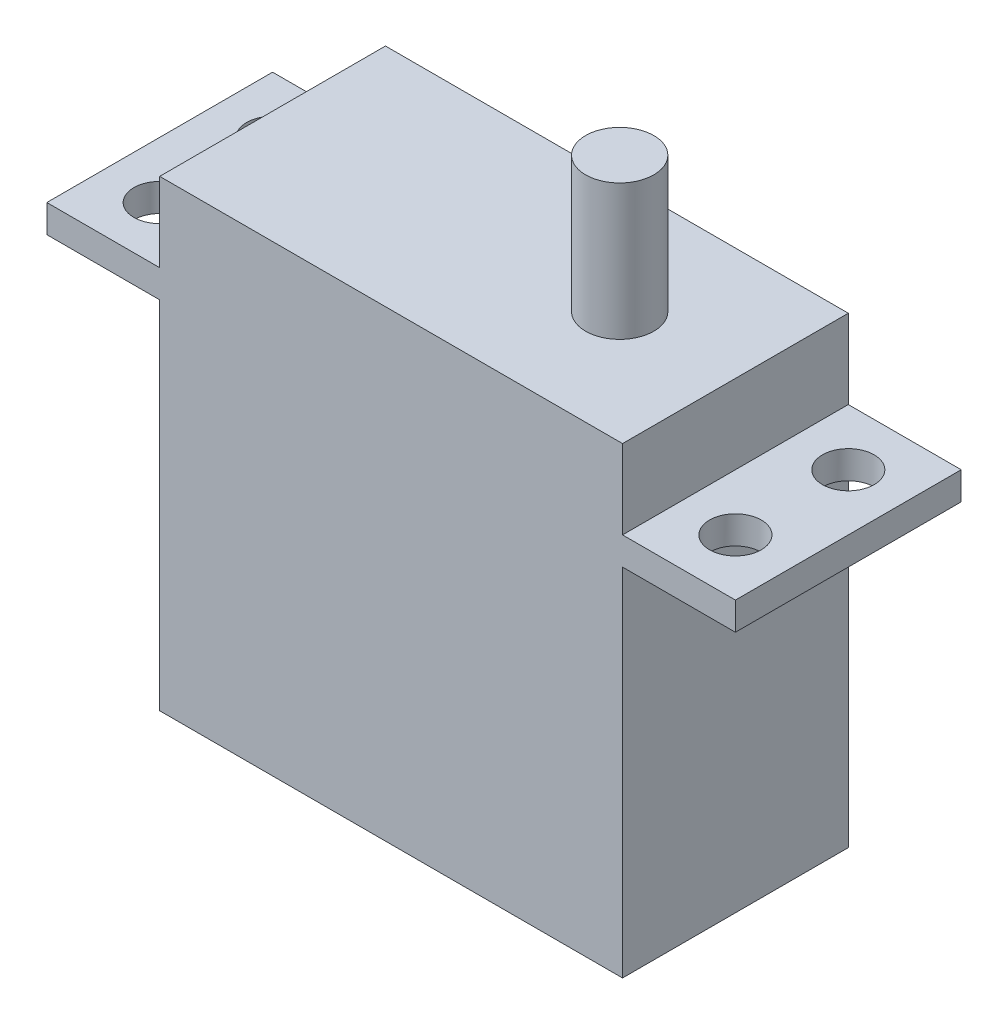
ISO-10303-21;
HEADER;
FILE_DESCRIPTION(('STEP AP214'),'2;1');
FILE_NAME('part.step','',(''),(''),'','','');
FILE_SCHEMA(('AUTOMOTIVE_DESIGN { 1 0 10303 214 1 1 1 1 }'));
ENDSEC;
DATA;
#1=APPLICATION_CONTEXT('core data for automotive mechanical design processes');
#2=APPLICATION_PROTOCOL_DEFINITION('international standard','automotive_design',2000,#1);
#3=PRODUCT_CONTEXT('',#1,'mechanical');
#4=PRODUCT('Part','Part','',(#3));
#5=PRODUCT_RELATED_PRODUCT_CATEGORY('part','',(#4));
#6=PRODUCT_DEFINITION_FORMATION('','',#4);
#7=PRODUCT_DEFINITION_CONTEXT('part definition',#1,'design');
#8=PRODUCT_DEFINITION('design','',#6,#7);
#9=PRODUCT_DEFINITION_SHAPE('','',#8);
#10=(LENGTH_UNIT() NAMED_UNIT(*) SI_UNIT(.MILLI.,.METRE.));
#11=(NAMED_UNIT(*) PLANE_ANGLE_UNIT() SI_UNIT($,.RADIAN.));
#12=(NAMED_UNIT(*) SI_UNIT($,.STERADIAN.) SOLID_ANGLE_UNIT());
#13=UNCERTAINTY_MEASURE_WITH_UNIT(LENGTH_MEASURE(1.E-05),#10,'distance_accuracy_value','');
#14=(GEOMETRIC_REPRESENTATION_CONTEXT(3) GLOBAL_UNCERTAINTY_ASSIGNED_CONTEXT((#13)) GLOBAL_UNIT_ASSIGNED_CONTEXT((#10,
#11,#12)) REPRESENTATION_CONTEXT('',''));
#15=CARTESIAN_POINT('',(0.,0.,0.));
#16=DIRECTION('',(0.,0.,1.));
#17=DIRECTION('',(1.,0.,0.));
#18=AXIS2_PLACEMENT_3D('',#15,#16,#17);
#19=CARTESIAN_POINT('',(30.75,41.,-10.));
#20=DIRECTION('',(1.,0.,0.));
#21=DIRECTION('',(0.,0.,-1.));
#22=AXIS2_PLACEMENT_3D('',#19,#20,#21);
#23=PLANE('',#22);
#24=DIRECTION('',(0.,-1.,0.));
#25=VECTOR('',#24,1.);
#26=CARTESIAN_POINT('',(30.75,41.,9.99999999999999));
#27=LINE('',#26,#25);
#28=CARTESIAN_POINT('',(30.75,41.,9.99999999999999));
#29=VERTEX_POINT('',#28);
#30=CARTESIAN_POINT('',(30.75,33.9931485038956,9.99999999999999));
#31=VERTEX_POINT('',#30);
#32=EDGE_CURVE('E168',#29,#31,#27,.T.);
#33=ORIENTED_EDGE('',*,*,#32,.T.);
#34=DIRECTION('',(0.,0.,-1.));
#35=VECTOR('',#34,1.);
#36=CARTESIAN_POINT('',(30.75,33.9931485038956,9.99999999999999));
#37=LINE('',#36,#35);
#38=CARTESIAN_POINT('',(30.75,33.9931485038956,-10.));
#39=VERTEX_POINT('',#38);
#40=EDGE_CURVE('E140',#31,#39,#37,.T.);
#41=ORIENTED_EDGE('',*,*,#40,.T.);
#42=DIRECTION('',(0.,-1.,0.));
#43=VECTOR('',#42,1.);
#44=CARTESIAN_POINT('',(30.75,41.,-10.));
#45=LINE('',#44,#43);
#46=CARTESIAN_POINT('',(30.75,41.,-10.));
#47=VERTEX_POINT('',#46);
#48=EDGE_CURVE('E165',#47,#39,#45,.T.);
#49=ORIENTED_EDGE('',*,*,#48,.F.);
#50=DIRECTION('',(0.,0.,1.));
#51=VECTOR('',#50,1.);
#52=CARTESIAN_POINT('',(30.75,41.,-10.));
#53=LINE('',#52,#51);
#54=EDGE_CURVE('E159',#47,#29,#53,.T.);
#55=ORIENTED_EDGE('',*,*,#54,.T.);
#56=EDGE_LOOP('',(#33,#41,#49,#55));
#57=FACE_BOUND('',#56,.T.);
#58=ADVANCED_FACE('F32',(#57),#23,.T.);
#59=CARTESIAN_POINT('',(30.75,31.5252167695847,-10.));
#60=VERTEX_POINT('',#59);
#61=CARTESIAN_POINT('',(30.75,0.,-10.));
#62=VERTEX_POINT('',#61);
#63=EDGE_CURVE('E162',#60,#62,#45,.T.);
#64=ORIENTED_EDGE('',*,*,#63,.F.);
#65=DIRECTION('',(0.,0.,1.));
#66=VECTOR('',#65,1.);
#67=CARTESIAN_POINT('',(30.75,31.5252167695847,9.99999999999999));
#68=LINE('',#67,#66);
#69=CARTESIAN_POINT('',(30.75,31.5252167695847,9.99999999999999));
#70=VERTEX_POINT('',#69);
#71=EDGE_CURVE('E150',#60,#70,#68,.T.);
#72=ORIENTED_EDGE('',*,*,#71,.T.);
#73=CARTESIAN_POINT('',(30.75,0.,9.99999999999999));
#74=VERTEX_POINT('',#73);
#75=EDGE_CURVE('E128',#70,#74,#27,.T.);
#76=ORIENTED_EDGE('',*,*,#75,.T.);
#77=DIRECTION('',(0.,0.,1.));
#78=VECTOR('',#77,1.);
#79=CARTESIAN_POINT('',(30.75,0.,-10.));
#80=LINE('',#79,#78);
#81=EDGE_CURVE('E129',#62,#74,#80,.T.);
#82=ORIENTED_EDGE('',*,*,#81,.F.);
#83=EDGE_LOOP('',(#64,#72,#76,#82));
#84=FACE_BOUND('',#83,.T.);
#85=ADVANCED_FACE('F245',(#84),#23,.T.);
#86=CARTESIAN_POINT('',(-10.25,41.,-10.));
#87=DIRECTION('',(1.,0.,0.));
#88=DIRECTION('',(0.,0.,-1.));
#89=AXIS2_PLACEMENT_3D('',#86,#87,#88);
#90=PLANE('',#89);
#91=DIRECTION('',(0.,0.,1.));
#92=VECTOR('',#91,1.);
#93=CARTESIAN_POINT('',(-10.25,31.5252167695847,10.));
#94=LINE('',#93,#92);
#95=CARTESIAN_POINT('',(-10.25,31.5252167695847,-10.));
#96=VERTEX_POINT('',#95);
#97=CARTESIAN_POINT('',(-10.25,31.5252167695847,10.));
#98=VERTEX_POINT('',#97);
#99=EDGE_CURVE('E57',#96,#98,#94,.T.);
#100=ORIENTED_EDGE('',*,*,#99,.F.);
#101=DIRECTION('',(0.,-1.,0.));
#102=VECTOR('',#101,1.);
#103=CARTESIAN_POINT('',(-10.25,41.,-10.));
#104=LINE('',#103,#102);
#105=CARTESIAN_POINT('',(-10.25,0.,-10.));
#106=VERTEX_POINT('',#105);
#107=EDGE_CURVE('E41',#96,#106,#104,.T.);
#108=ORIENTED_EDGE('',*,*,#107,.T.);
#109=DIRECTION('',(0.,0.,1.));
#110=VECTOR('',#109,1.);
#111=CARTESIAN_POINT('',(-10.25,0.,-10.));
#112=LINE('',#111,#110);
#113=CARTESIAN_POINT('',(-10.25,0.,10.));
#114=VERTEX_POINT('',#113);
#115=EDGE_CURVE('E214',#106,#114,#112,.T.);
#116=ORIENTED_EDGE('',*,*,#115,.T.);
#117=DIRECTION('',(0.,-1.,0.));
#118=VECTOR('',#117,1.);
#119=CARTESIAN_POINT('',(-10.25,41.,10.));
#120=LINE('',#119,#118);
#121=EDGE_CURVE('E211',#98,#114,#120,.T.);
#122=ORIENTED_EDGE('',*,*,#121,.F.);
#123=EDGE_LOOP('',(#100,#108,#116,#122));
#124=FACE_BOUND('',#123,.T.);
#125=ADVANCED_FACE('F250',(#124),#90,.F.);
#126=DIRECTION('',(0.,0.,-1.));
#127=VECTOR('',#126,1.);
#128=CARTESIAN_POINT('',(-10.25,33.9931485038956,10.));
#129=LINE('',#128,#127);
#130=CARTESIAN_POINT('',(-10.25,33.9931485038956,10.));
#131=VERTEX_POINT('',#130);
#132=CARTESIAN_POINT('',(-10.25,33.9931485038956,-10.));
#133=VERTEX_POINT('',#132);
#134=EDGE_CURVE('E188',#131,#133,#129,.T.);
#135=ORIENTED_EDGE('',*,*,#134,.F.);
#136=CARTESIAN_POINT('',(-10.25,41.,10.));
#137=VERTEX_POINT('',#136);
#138=EDGE_CURVE('E218',#137,#131,#120,.T.);
#139=ORIENTED_EDGE('',*,*,#138,.F.);
#140=DIRECTION('',(0.,0.,1.));
#141=VECTOR('',#140,1.);
#142=CARTESIAN_POINT('',(-10.25,41.,-10.));
#143=LINE('',#142,#141);
#144=CARTESIAN_POINT('',(-10.25,41.,-10.));
#145=VERTEX_POINT('',#144);
#146=EDGE_CURVE('E206',#145,#137,#143,.T.);
#147=ORIENTED_EDGE('',*,*,#146,.F.);
#148=EDGE_CURVE('E11',#145,#133,#104,.T.);
#149=ORIENTED_EDGE('',*,*,#148,.T.);
#150=EDGE_LOOP('',(#135,#139,#147,#149));
#151=FACE_BOUND('',#150,.T.);
#152=ADVANCED_FACE('F311',(#151),#90,.F.);
#153=CARTESIAN_POINT('',(-10.25,41.,-10.));
#154=DIRECTION('',(0.,0.,1.));
#155=DIRECTION('',(1.,0.,0.));
#156=AXIS2_PLACEMENT_3D('',#153,#154,#155);
#157=PLANE('',#156);
#158=DIRECTION('',(-1.,0.,0.));
#159=VECTOR('',#158,1.);
#160=CARTESIAN_POINT('',(-10.25,0.,-10.));
#161=LINE('',#160,#159);
#162=EDGE_CURVE('E203',#62,#106,#161,.T.);
#163=ORIENTED_EDGE('',*,*,#162,.T.);
#164=ORIENTED_EDGE('',*,*,#107,.F.);
#165=DIRECTION('',(1.,0.,0.));
#166=VECTOR('',#165,1.);
#167=CARTESIAN_POINT('',(-20.25,31.5252167695847,-10.));
#168=LINE('',#167,#166);
#169=CARTESIAN_POINT('',(-20.25,31.5252167695847,-10.));
#170=VERTEX_POINT('',#169);
#171=EDGE_CURVE('E194',#170,#96,#168,.T.);
#172=ORIENTED_EDGE('',*,*,#171,.F.);
#173=DIRECTION('',(0.,-1.,0.));
#174=VECTOR('',#173,1.);
#175=CARTESIAN_POINT('',(-20.25,33.9931485038956,-10.));
#176=LINE('',#175,#174);
#177=CARTESIAN_POINT('',(-20.25,33.9931485038956,-10.));
#178=VERTEX_POINT('',#177);
#179=EDGE_CURVE('E183',#178,#170,#176,.T.);
#180=ORIENTED_EDGE('',*,*,#179,.F.);
#181=DIRECTION('',(1.,0.,0.));
#182=VECTOR('',#181,1.);
#183=CARTESIAN_POINT('',(-20.25,33.9931485038956,-10.));
#184=LINE('',#183,#182);
#185=EDGE_CURVE('E197',#178,#133,#184,.T.);
#186=ORIENTED_EDGE('',*,*,#185,.T.);
#187=ORIENTED_EDGE('',*,*,#148,.F.);
#188=DIRECTION('',(-1.,0.,0.));
#189=VECTOR('',#188,1.);
#190=CARTESIAN_POINT('',(-10.25,41.,-10.));
#191=LINE('',#190,#189);
#192=EDGE_CURVE('E204',#47,#145,#191,.T.);
#193=ORIENTED_EDGE('',*,*,#192,.F.);
#194=ORIENTED_EDGE('',*,*,#48,.T.);
#195=DIRECTION('',(-1.,0.,0.));
#196=VECTOR('',#195,1.);
#197=CARTESIAN_POINT('',(40.75,33.9931485038956,-10.));
#198=LINE('',#197,#196);
#199=CARTESIAN_POINT('',(40.75,33.9931485038956,-10.));
#200=VERTEX_POINT('',#199);
#201=EDGE_CURVE('E156',#200,#39,#198,.T.);
#202=ORIENTED_EDGE('',*,*,#201,.F.);
#203=DIRECTION('',(0.,-1.,0.));
#204=VECTOR('',#203,1.);
#205=CARTESIAN_POINT('',(40.75,33.9931485038956,-10.));
#206=LINE('',#205,#204);
#207=CARTESIAN_POINT('',(40.75,31.5252167695847,-10.));
#208=VERTEX_POINT('',#207);
#209=EDGE_CURVE('E143',#200,#208,#206,.T.);
#210=ORIENTED_EDGE('',*,*,#209,.T.);
#211=DIRECTION('',(-1.,0.,0.));
#212=VECTOR('',#211,1.);
#213=CARTESIAN_POINT('',(40.75,31.5252167695847,-10.));
#214=LINE('',#213,#212);
#215=EDGE_CURVE('E130',#208,#60,#214,.T.);
#216=ORIENTED_EDGE('',*,*,#215,.T.);
#217=ORIENTED_EDGE('',*,*,#63,.T.);
#218=EDGE_LOOP('',(#163,#164,#172,#180,#186,#187,#193,#194,#202,#210,#216,#217));
#219=FACE_BOUND('',#218,.T.);
#220=ADVANCED_FACE('F34',(#219),#157,.F.);
#221=CARTESIAN_POINT('',(-10.25,41.,10.));
#222=DIRECTION('',(0.,0.,-1.));
#223=DIRECTION('',(-1.,0.,0.));
#224=AXIS2_PLACEMENT_3D('',#221,#222,#223);
#225=PLANE('',#224);
#226=DIRECTION('',(1.,0.,0.));
#227=VECTOR('',#226,1.);
#228=CARTESIAN_POINT('',(-10.25,0.,10.));
#229=LINE('',#228,#227);
#230=EDGE_CURVE('E207',#114,#74,#229,.T.);
#231=ORIENTED_EDGE('',*,*,#230,.T.);
#232=ORIENTED_EDGE('',*,*,#75,.F.);
#233=DIRECTION('',(-1.,0.,0.));
#234=VECTOR('',#233,1.);
#235=CARTESIAN_POINT('',(40.75,31.5252167695847,9.99999999999999));
#236=LINE('',#235,#234);
#237=CARTESIAN_POINT('',(40.75,31.5252167695847,9.99999999999999));
#238=VERTEX_POINT('',#237);
#239=EDGE_CURVE('E49',#238,#70,#236,.T.);
#240=ORIENTED_EDGE('',*,*,#239,.F.);
#241=DIRECTION('',(0.,1.,0.));
#242=VECTOR('',#241,1.);
#243=CARTESIAN_POINT('',(40.75,33.9931485038956,9.99999999999999));
#244=LINE('',#243,#242);
#245=CARTESIAN_POINT('',(40.75,33.9931485038956,9.99999999999999));
#246=VERTEX_POINT('',#245);
#247=EDGE_CURVE('E126',#238,#246,#244,.T.);
#248=ORIENTED_EDGE('',*,*,#247,.T.);
#249=DIRECTION('',(-1.,0.,0.));
#250=VECTOR('',#249,1.);
#251=CARTESIAN_POINT('',(40.75,33.9931485038956,9.99999999999999));
#252=LINE('',#251,#250);
#253=EDGE_CURVE('E149',#246,#31,#252,.T.);
#254=ORIENTED_EDGE('',*,*,#253,.T.);
#255=ORIENTED_EDGE('',*,*,#32,.F.);
#256=DIRECTION('',(1.,0.,0.));
#257=VECTOR('',#256,1.);
#258=CARTESIAN_POINT('',(-10.25,41.,10.));
#259=LINE('',#258,#257);
#260=EDGE_CURVE('E209',#137,#29,#259,.T.);
#261=ORIENTED_EDGE('',*,*,#260,.F.);
#262=ORIENTED_EDGE('',*,*,#138,.T.);
#263=DIRECTION('',(1.,0.,0.));
#264=VECTOR('',#263,1.);
#265=CARTESIAN_POINT('',(-20.25,33.9931485038956,10.));
#266=LINE('',#265,#264);
#267=CARTESIAN_POINT('',(-20.25,33.9931485038956,10.));
#268=VERTEX_POINT('',#267);
#269=EDGE_CURVE('E200',#268,#131,#266,.T.);
#270=ORIENTED_EDGE('',*,*,#269,.F.);
#271=DIRECTION('',(0.,1.,0.));
#272=VECTOR('',#271,1.);
#273=CARTESIAN_POINT('',(-20.25,33.9931485038956,10.));
#274=LINE('',#273,#272);
#275=CARTESIAN_POINT('',(-20.25,31.5252167695847,10.));
#276=VERTEX_POINT('',#275);
#277=EDGE_CURVE('E178',#276,#268,#274,.T.);
#278=ORIENTED_EDGE('',*,*,#277,.F.);
#279=DIRECTION('',(1.,0.,0.));
#280=VECTOR('',#279,1.);
#281=CARTESIAN_POINT('',(-20.25,31.5252167695847,10.));
#282=LINE('',#281,#280);
#283=EDGE_CURVE('E187',#276,#98,#282,.T.);
#284=ORIENTED_EDGE('',*,*,#283,.T.);
#285=ORIENTED_EDGE('',*,*,#121,.T.);
#286=EDGE_LOOP('',(#231,#232,#240,#248,#254,#255,#261,#262,#270,#278,#284,#285));
#287=FACE_BOUND('',#286,.T.);
#288=ADVANCED_FACE('F125',(#287),#225,.F.);
#289=CARTESIAN_POINT('',(0.,41.,0.));
#290=DIRECTION('',(0.,1.,0.));
#291=DIRECTION('',(0.,0.,1.));
#292=AXIS2_PLACEMENT_3D('',#289,#290,#291);
#293=PLANE('',#292);
#294=CARTESIAN_POINT('',(20.5,41.,0.));
#295=DIRECTION('',(0.,1.,0.));
#296=DIRECTION('',(0.,0.,1.));
#297=AXIS2_PLACEMENT_3D('',#294,#295,#296);
#298=CIRCLE('',#297,3.01871854924617);
#299=CARTESIAN_POINT('',(20.5,41.,3.01871854924617));
#300=VERTEX_POINT('',#299);
#301=EDGE_CURVE('E279',#300,#300,#298,.T.);
#302=ORIENTED_EDGE('',*,*,#301,.F.);
#303=EDGE_LOOP('',(#302));
#304=FACE_BOUND('',#303,.T.);
#305=ORIENTED_EDGE('',*,*,#260,.T.);
#306=ORIENTED_EDGE('',*,*,#54,.F.);
#307=ORIENTED_EDGE('',*,*,#192,.T.);
#308=ORIENTED_EDGE('',*,*,#146,.T.);
#309=EDGE_LOOP('',(#305,#306,#307,#308));
#310=FACE_BOUND('',#309,.T.);
#311=ADVANCED_FACE('F307',(#304,#310),#293,.T.);
#312=CARTESIAN_POINT('',(0.,0.,0.));
#313=DIRECTION('',(0.,1.,0.));
#314=DIRECTION('',(0.,0.,1.));
#315=AXIS2_PLACEMENT_3D('',#312,#313,#314);
#316=PLANE('',#315);
#317=ORIENTED_EDGE('',*,*,#162,.F.);
#318=ORIENTED_EDGE('',*,*,#81,.T.);
#319=ORIENTED_EDGE('',*,*,#230,.F.);
#320=ORIENTED_EDGE('',*,*,#115,.F.);
#321=EDGE_LOOP('',(#317,#318,#319,#320));
#322=FACE_BOUND('',#321,.T.);
#323=ADVANCED_FACE('F330',(#322),#316,.F.);
#324=CARTESIAN_POINT('',(-20.25,33.9931485038956,10.));
#325=DIRECTION('',(0.,-1.,0.));
#326=DIRECTION('',(0.,0.,-1.));
#327=AXIS2_PLACEMENT_3D('',#324,#325,#326);
#328=PLANE('',#327);
#329=CARTESIAN_POINT('',(-15.25,33.9931485038956,-5.));
#330=DIRECTION('',(0.,1.,0.));
#331=DIRECTION('',(0.,0.,1.));
#332=AXIS2_PLACEMENT_3D('',#329,#330,#331);
#333=CIRCLE('',#332,2.2903139359252);
#334=CARTESIAN_POINT('',(-15.25,33.9931485038956,-2.70968606407479));
#335=VERTEX_POINT('',#334);
#336=EDGE_CURVE('E172',#335,#335,#333,.T.);
#337=ORIENTED_EDGE('',*,*,#336,.F.);
#338=EDGE_LOOP('',(#337));
#339=FACE_BOUND('',#338,.T.);
#340=CARTESIAN_POINT('',(-15.2499999999999,33.9931485038956,5.));
#341=DIRECTION('',(0.,1.,0.));
#342=DIRECTION('',(0.,0.,1.));
#343=AXIS2_PLACEMENT_3D('',#340,#341,#342);
#344=CIRCLE('',#343,2.2903139359252);
#345=CARTESIAN_POINT('',(-15.2499999999999,33.9931485038956,7.29031393592521));
#346=VERTEX_POINT('',#345);
#347=EDGE_CURVE('E171',#346,#346,#344,.T.);
#348=ORIENTED_EDGE('',*,*,#347,.F.);
#349=EDGE_LOOP('',(#348));
#350=FACE_BOUND('',#349,.T.);
#351=ORIENTED_EDGE('',*,*,#134,.T.);
#352=ORIENTED_EDGE('',*,*,#185,.F.);
#353=DIRECTION('',(0.,0.,-1.));
#354=VECTOR('',#353,1.);
#355=CARTESIAN_POINT('',(-20.25,33.9931485038956,10.));
#356=LINE('',#355,#354);
#357=EDGE_CURVE('E181',#268,#178,#356,.T.);
#358=ORIENTED_EDGE('',*,*,#357,.F.);
#359=ORIENTED_EDGE('',*,*,#269,.T.);
#360=EDGE_LOOP('',(#351,#352,#358,#359));
#361=FACE_BOUND('',#360,.T.);
#362=ADVANCED_FACE('F314',(#339,#350,#361),#328,.F.);
#363=CARTESIAN_POINT('',(-20.25,31.5252167695847,10.));
#364=DIRECTION('',(0.,1.,0.));
#365=DIRECTION('',(0.,0.,1.));
#366=AXIS2_PLACEMENT_3D('',#363,#364,#365);
#367=PLANE('',#366);
#368=CARTESIAN_POINT('',(-15.25,31.5252167695847,-5.));
#369=DIRECTION('',(0.,1.,0.));
#370=DIRECTION('',(0.,0.,1.));
#371=AXIS2_PLACEMENT_3D('',#368,#369,#370);
#372=CIRCLE('',#371,2.2903139359252);
#373=CARTESIAN_POINT('',(-15.25,31.5252167695847,-2.70968606407479));
#374=VERTEX_POINT('',#373);
#375=EDGE_CURVE('E36',#374,#374,#372,.T.);
#376=ORIENTED_EDGE('',*,*,#375,.T.);
#377=EDGE_LOOP('',(#376));
#378=FACE_BOUND('',#377,.T.);
#379=CARTESIAN_POINT('',(-15.2499999999999,31.5252167695847,5.));
#380=DIRECTION('',(0.,1.,0.));
#381=DIRECTION('',(0.,0.,1.));
#382=AXIS2_PLACEMENT_3D('',#379,#380,#381);
#383=CIRCLE('',#382,2.2903139359252);
#384=CARTESIAN_POINT('',(-15.2499999999999,31.5252167695847,7.29031393592521));
#385=VERTEX_POINT('',#384);
#386=EDGE_CURVE('E175',#385,#385,#383,.T.);
#387=ORIENTED_EDGE('',*,*,#386,.T.);
#388=EDGE_LOOP('',(#387));
#389=FACE_BOUND('',#388,.T.);
#390=ORIENTED_EDGE('',*,*,#99,.T.);
#391=ORIENTED_EDGE('',*,*,#283,.F.);
#392=DIRECTION('',(0.,0.,1.));
#393=VECTOR('',#392,1.);
#394=CARTESIAN_POINT('',(-20.25,31.5252167695847,10.));
#395=LINE('',#394,#393);
#396=EDGE_CURVE('E185',#170,#276,#395,.T.);
#397=ORIENTED_EDGE('',*,*,#396,.F.);
#398=ORIENTED_EDGE('',*,*,#171,.T.);
#399=EDGE_LOOP('',(#390,#391,#397,#398));
#400=FACE_BOUND('',#399,.T.);
#401=ADVANCED_FACE('F226',(#378,#389,#400),#367,.F.);
#402=CARTESIAN_POINT('',(-20.25,0.,0.));
#403=DIRECTION('',(1.,0.,0.));
#404=DIRECTION('',(0.,0.,-1.));
#405=AXIS2_PLACEMENT_3D('',#402,#403,#404);
#406=PLANE('',#405);
#407=ORIENTED_EDGE('',*,*,#277,.T.);
#408=ORIENTED_EDGE('',*,*,#357,.T.);
#409=ORIENTED_EDGE('',*,*,#179,.T.);
#410=ORIENTED_EDGE('',*,*,#396,.T.);
#411=EDGE_LOOP('',(#407,#408,#409,#410));
#412=FACE_BOUND('',#411,.T.);
#413=ADVANCED_FACE('F240',(#412),#406,.F.);
#414=CARTESIAN_POINT('',(-15.2499999999999,23.9931485038956,5.));
#415=DIRECTION('',(0.,1.,0.));
#416=DIRECTION('',(0.,0.,1.));
#417=AXIS2_PLACEMENT_3D('',#414,#415,#416);
#418=CYLINDRICAL_SURFACE('',#417,2.2903139359252);
#419=ORIENTED_EDGE('',*,*,#347,.T.);
#420=EDGE_LOOP('',(#419));
#421=FACE_BOUND('',#420,.T.);
#422=ORIENTED_EDGE('',*,*,#386,.F.);
#423=EDGE_LOOP('',(#422));
#424=FACE_BOUND('',#423,.T.);
#425=ADVANCED_FACE('F230',(#421,#424),#418,.F.);
#426=CARTESIAN_POINT('',(-15.25,23.9931485038956,-5.));
#427=DIRECTION('',(0.,1.,0.));
#428=DIRECTION('',(0.,0.,1.));
#429=AXIS2_PLACEMENT_3D('',#426,#427,#428);
#430=CYLINDRICAL_SURFACE('',#429,2.2903139359252);
#431=ORIENTED_EDGE('',*,*,#336,.T.);
#432=EDGE_LOOP('',(#431));
#433=FACE_BOUND('',#432,.T.);
#434=ORIENTED_EDGE('',*,*,#375,.F.);
#435=EDGE_LOOP('',(#434));
#436=FACE_BOUND('',#435,.T.);
#437=ADVANCED_FACE('F228',(#433,#436),#430,.F.);
#438=CARTESIAN_POINT('',(40.75,31.5252167695847,9.99999999999999));
#439=DIRECTION('',(0.,-1.,0.));
#440=DIRECTION('',(0.,0.,-1.));
#441=AXIS2_PLACEMENT_3D('',#438,#439,#440);
#442=PLANE('',#441);
#443=CARTESIAN_POINT('',(35.75,31.5252167695847,-5.00000000000001));
#444=DIRECTION('',(0.,-1.,0.));
#445=DIRECTION('',(0.,0.,-1.));
#446=AXIS2_PLACEMENT_3D('',#443,#444,#445);
#447=CIRCLE('',#446,2.2903139359252);
#448=CARTESIAN_POINT('',(35.75,31.5252167695847,-7.29031393592521));
#449=VERTEX_POINT('',#448);
#450=EDGE_CURVE('E152',#449,#449,#447,.F.);
#451=ORIENTED_EDGE('',*,*,#450,.T.);
#452=EDGE_LOOP('',(#451));
#453=FACE_BOUND('',#452,.T.);
#454=CARTESIAN_POINT('',(35.7499999999999,31.5252167695847,4.99999999999999));
#455=DIRECTION('',(0.,-1.,0.));
#456=DIRECTION('',(0.,0.,-1.));
#457=AXIS2_PLACEMENT_3D('',#454,#455,#456);
#458=CIRCLE('',#457,2.2903139359252);
#459=CARTESIAN_POINT('',(35.7499999999999,31.5252167695847,2.70968606407479));
#460=VERTEX_POINT('',#459);
#461=EDGE_CURVE('E288',#460,#460,#458,.F.);
#462=ORIENTED_EDGE('',*,*,#461,.T.);
#463=EDGE_LOOP('',(#462));
#464=FACE_BOUND('',#463,.T.);
#465=ORIENTED_EDGE('',*,*,#71,.F.);
#466=ORIENTED_EDGE('',*,*,#215,.F.);
#467=DIRECTION('',(0.,0.,1.));
#468=VECTOR('',#467,1.);
#469=CARTESIAN_POINT('',(40.75,31.5252167695847,9.99999999999999));
#470=LINE('',#469,#468);
#471=EDGE_CURVE('E136',#208,#238,#470,.T.);
#472=ORIENTED_EDGE('',*,*,#471,.T.);
#473=ORIENTED_EDGE('',*,*,#239,.T.);
#474=EDGE_LOOP('',(#465,#466,#472,#473));
#475=FACE_BOUND('',#474,.T.);
#476=ADVANCED_FACE('F142',(#453,#464,#475),#442,.T.);
#477=CARTESIAN_POINT('',(40.75,33.9931485038956,9.99999999999999));
#478=DIRECTION('',(0.,1.,0.));
#479=DIRECTION('',(0.,0.,1.));
#480=AXIS2_PLACEMENT_3D('',#477,#478,#479);
#481=PLANE('',#480);
#482=CARTESIAN_POINT('',(35.75,33.9931485038956,-5.00000000000001));
#483=DIRECTION('',(0.,-1.,0.));
#484=DIRECTION('',(0.,0.,1.));
#485=AXIS2_PLACEMENT_3D('',#482,#483,#484);
#486=CIRCLE('',#485,2.2903139359252);
#487=CARTESIAN_POINT('',(35.75,33.9931485038956,-2.7096860640748));
#488=VERTEX_POINT('',#487);
#489=EDGE_CURVE('E282',#488,#488,#486,.T.);
#490=ORIENTED_EDGE('',*,*,#489,.T.);
#491=EDGE_LOOP('',(#490));
#492=FACE_BOUND('',#491,.T.);
#493=CARTESIAN_POINT('',(35.7499999999999,33.9931485038956,4.99999999999999));
#494=DIRECTION('',(0.,-1.,0.));
#495=DIRECTION('',(0.,0.,1.));
#496=AXIS2_PLACEMENT_3D('',#493,#494,#495);
#497=CIRCLE('',#496,2.2903139359252);
#498=CARTESIAN_POINT('',(35.7499999999999,33.9931485038956,7.2903139359252));
#499=VERTEX_POINT('',#498);
#500=EDGE_CURVE('E278',#499,#499,#497,.T.);
#501=ORIENTED_EDGE('',*,*,#500,.T.);
#502=EDGE_LOOP('',(#501));
#503=FACE_BOUND('',#502,.T.);
#504=ORIENTED_EDGE('',*,*,#40,.F.);
#505=ORIENTED_EDGE('',*,*,#253,.F.);
#506=DIRECTION('',(0.,0.,-1.));
#507=VECTOR('',#506,1.);
#508=CARTESIAN_POINT('',(40.75,33.9931485038956,9.99999999999999));
#509=LINE('',#508,#507);
#510=EDGE_CURVE('E139',#246,#200,#509,.T.);
#511=ORIENTED_EDGE('',*,*,#510,.T.);
#512=ORIENTED_EDGE('',*,*,#201,.T.);
#513=EDGE_LOOP('',(#504,#505,#511,#512));
#514=FACE_BOUND('',#513,.T.);
#515=ADVANCED_FACE('F237',(#492,#503,#514),#481,.T.);
#516=CARTESIAN_POINT('',(40.75,0.,0.));
#517=DIRECTION('',(-1.,0.,0.));
#518=DIRECTION('',(0.,0.,-1.));
#519=AXIS2_PLACEMENT_3D('',#516,#517,#518);
#520=PLANE('',#519);
#521=ORIENTED_EDGE('',*,*,#247,.F.);
#522=ORIENTED_EDGE('',*,*,#471,.F.);
#523=ORIENTED_EDGE('',*,*,#209,.F.);
#524=ORIENTED_EDGE('',*,*,#510,.F.);
#525=EDGE_LOOP('',(#521,#522,#523,#524));
#526=FACE_BOUND('',#525,.T.);
#527=ADVANCED_FACE('F134',(#526),#520,.F.);
#528=CARTESIAN_POINT('',(35.7499999999999,23.9931485038956,4.99999999999999));
#529=DIRECTION('',(0.,1.,0.));
#530=DIRECTION('',(0.,0.,1.));
#531=AXIS2_PLACEMENT_3D('',#528,#529,#530);
#532=CYLINDRICAL_SURFACE('',#531,2.2903139359252);
#533=ORIENTED_EDGE('',*,*,#461,.F.);
#534=EDGE_LOOP('',(#533));
#535=FACE_BOUND('',#534,.T.);
#536=ORIENTED_EDGE('',*,*,#500,.F.);
#537=EDGE_LOOP('',(#536));
#538=FACE_BOUND('',#537,.T.);
#539=ADVANCED_FACE('F258',(#535,#538),#532,.F.);
#540=CARTESIAN_POINT('',(35.75,23.9931485038956,-5.00000000000001));
#541=DIRECTION('',(0.,1.,0.));
#542=DIRECTION('',(0.,0.,1.));
#543=AXIS2_PLACEMENT_3D('',#540,#541,#542);
#544=CYLINDRICAL_SURFACE('',#543,2.2903139359252);
#545=ORIENTED_EDGE('',*,*,#450,.F.);
#546=EDGE_LOOP('',(#545));
#547=FACE_BOUND('',#546,.T.);
#548=ORIENTED_EDGE('',*,*,#489,.F.);
#549=EDGE_LOOP('',(#548));
#550=FACE_BOUND('',#549,.T.);
#551=ADVANCED_FACE('F261',(#547,#550),#544,.F.);
#552=CARTESIAN_POINT('',(20.5,53.,0.));
#553=DIRECTION('',(0.,-1.,0.));
#554=DIRECTION('',(0.,0.,-1.));
#555=AXIS2_PLACEMENT_3D('',#552,#553,#554);
#556=CYLINDRICAL_SURFACE('',#555,3.01871854924617);
#557=CARTESIAN_POINT('',(20.5,53.,0.));
#558=DIRECTION('',(0.,1.,0.));
#559=DIRECTION('',(0.,0.,1.));
#560=AXIS2_PLACEMENT_3D('',#557,#558,#559);
#561=CIRCLE('',#560,3.01871854924617);
#562=CARTESIAN_POINT('',(20.5,53.,3.01871854924617));
#563=VERTEX_POINT('',#562);
#564=EDGE_CURVE('E277',#563,#563,#561,.T.);
#565=ORIENTED_EDGE('',*,*,#564,.F.);
#566=EDGE_LOOP('',(#565));
#567=FACE_BOUND('',#566,.T.);
#568=ORIENTED_EDGE('',*,*,#301,.T.);
#569=EDGE_LOOP('',(#568));
#570=FACE_BOUND('',#569,.T.);
#571=ADVANCED_FACE('F265',(#567,#570),#556,.T.);
#572=CARTESIAN_POINT('',(20.5,53.,0.));
#573=DIRECTION('',(0.,1.,0.));
#574=DIRECTION('',(0.,0.,1.));
#575=AXIS2_PLACEMENT_3D('',#572,#573,#574);
#576=PLANE('',#575);
#577=ORIENTED_EDGE('',*,*,#564,.T.);
#578=EDGE_LOOP('',(#577));
#579=FACE_BOUND('',#578,.T.);
#580=ADVANCED_FACE('F269',(#579),#576,.T.);
#581=CLOSED_SHELL('',(#58,#85,#125,#152,#220,#288,#311,#323,#362,#401,#413,#425,#437,#476,#515,
#527,#539,#551,#571,#580));
#582=MANIFOLD_SOLID_BREP('B2',#581);
#583=ADVANCED_BREP_SHAPE_REPRESENTATION('',(#18,#582),#14);
#584=SHAPE_DEFINITION_REPRESENTATION(#9,#583);
ENDSEC;
END-ISO-10303-21;
